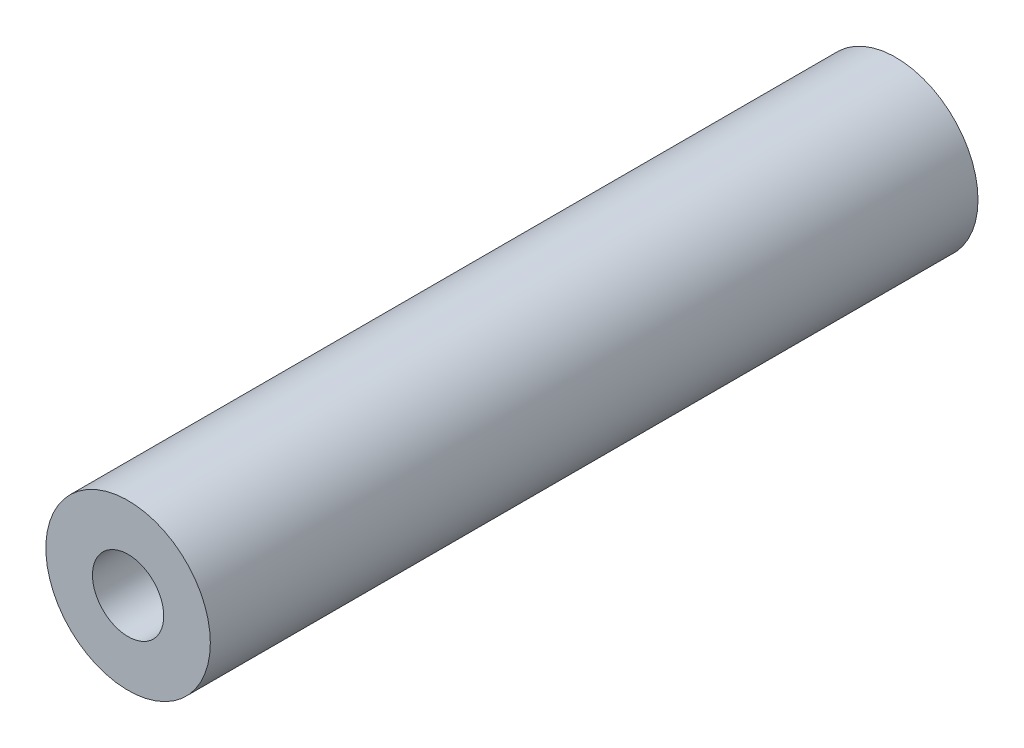
ISO-10303-21;
HEADER;
FILE_DESCRIPTION(('STEP AP214'),'2;1');
FILE_NAME('part.step','',(''),(''),'','','');
FILE_SCHEMA(('AUTOMOTIVE_DESIGN { 1 0 10303 214 1 1 1 1 }'));
ENDSEC;
DATA;
#1=APPLICATION_CONTEXT('core data for automotive mechanical design processes');
#2=APPLICATION_PROTOCOL_DEFINITION('international standard','automotive_design',2000,#1);
#3=PRODUCT_CONTEXT('',#1,'mechanical');
#4=PRODUCT('Part','Part','',(#3));
#5=PRODUCT_RELATED_PRODUCT_CATEGORY('part','',(#4));
#6=PRODUCT_DEFINITION_FORMATION('','',#4);
#7=PRODUCT_DEFINITION_CONTEXT('part definition',#1,'design');
#8=PRODUCT_DEFINITION('design','',#6,#7);
#9=PRODUCT_DEFINITION_SHAPE('','',#8);
#10=(LENGTH_UNIT() NAMED_UNIT(*) SI_UNIT(.MILLI.,.METRE.));
#11=(NAMED_UNIT(*) PLANE_ANGLE_UNIT() SI_UNIT($,.RADIAN.));
#12=(NAMED_UNIT(*) SI_UNIT($,.STERADIAN.) SOLID_ANGLE_UNIT());
#13=UNCERTAINTY_MEASURE_WITH_UNIT(LENGTH_MEASURE(1.E-05),#10,'distance_accuracy_value','');
#14=(GEOMETRIC_REPRESENTATION_CONTEXT(3) GLOBAL_UNCERTAINTY_ASSIGNED_CONTEXT((#13)) GLOBAL_UNIT_ASSIGNED_CONTEXT((#10,
#11,#12)) REPRESENTATION_CONTEXT('',''));
#15=CARTESIAN_POINT('',(0.,0.,0.));
#16=DIRECTION('',(0.,0.,1.));
#17=DIRECTION('',(1.,0.,0.));
#18=AXIS2_PLACEMENT_3D('',#15,#16,#17);
#19=CARTESIAN_POINT('',(0.,0.,28.));
#20=DIRECTION('',(0.,0.,1.));
#21=DIRECTION('',(1.,0.,0.));
#22=AXIS2_PLACEMENT_3D('',#19,#20,#21);
#23=PLANE('',#22);
#24=CARTESIAN_POINT('',(0.,0.,28.));
#25=DIRECTION('',(0.,0.,1.));
#26=DIRECTION('',(1.,0.,0.));
#27=AXIS2_PLACEMENT_3D('',#24,#25,#26);
#28=CIRCLE('',#27,3.);
#29=CARTESIAN_POINT('',(3.,0.,28.));
#30=VERTEX_POINT('',#29);
#31=EDGE_CURVE('E10',#30,#30,#28,.T.);
#32=ORIENTED_EDGE('',*,*,#31,.T.);
#33=EDGE_LOOP('',(#32));
#34=FACE_BOUND('',#33,.T.);
#35=CARTESIAN_POINT('',(0.,0.,28.));
#36=DIRECTION('',(0.,0.,1.));
#37=DIRECTION('',(1.,0.,0.));
#38=AXIS2_PLACEMENT_3D('',#35,#36,#37);
#39=CIRCLE('',#38,1.3);
#40=CARTESIAN_POINT('',(1.3,0.,28.));
#41=VERTEX_POINT('',#40);
#42=EDGE_CURVE('E55',#41,#41,#39,.T.);
#43=ORIENTED_EDGE('',*,*,#42,.F.);
#44=EDGE_LOOP('',(#43));
#45=FACE_BOUND('',#44,.T.);
#46=ADVANCED_FACE('F41',(#34,#45),#23,.T.);
#47=CARTESIAN_POINT('',(0.,0.,0.));
#48=DIRECTION('',(0.,0.,1.));
#49=DIRECTION('',(1.,0.,0.));
#50=AXIS2_PLACEMENT_3D('',#47,#48,#49);
#51=PLANE('',#50);
#52=CARTESIAN_POINT('',(0.,0.,0.));
#53=DIRECTION('',(0.,0.,1.));
#54=DIRECTION('',(1.,0.,0.));
#55=AXIS2_PLACEMENT_3D('',#52,#53,#54);
#56=CIRCLE('',#55,3.);
#57=CARTESIAN_POINT('',(3.,0.,0.));
#58=VERTEX_POINT('',#57);
#59=EDGE_CURVE('E44',#58,#58,#56,.T.);
#60=ORIENTED_EDGE('',*,*,#59,.F.);
#61=EDGE_LOOP('',(#60));
#62=FACE_BOUND('',#61,.T.);
#63=CARTESIAN_POINT('',(0.,0.,0.));
#64=DIRECTION('',(0.,0.,1.));
#65=DIRECTION('',(1.,0.,0.));
#66=AXIS2_PLACEMENT_3D('',#63,#64,#65);
#67=CIRCLE('',#66,1.3);
#68=CARTESIAN_POINT('',(1.3,0.,0.));
#69=VERTEX_POINT('',#68);
#70=EDGE_CURVE('E53',#69,#69,#67,.T.);
#71=ORIENTED_EDGE('',*,*,#70,.T.);
#72=EDGE_LOOP('',(#71));
#73=FACE_BOUND('',#72,.T.);
#74=ADVANCED_FACE('F63',(#62,#73),#51,.F.);
#75=CARTESIAN_POINT('',(0.,0.,28.));
#76=DIRECTION('',(0.,0.,-1.));
#77=DIRECTION('',(-1.,0.,0.));
#78=AXIS2_PLACEMENT_3D('',#75,#76,#77);
#79=CYLINDRICAL_SURFACE('',#78,3.);
#80=ORIENTED_EDGE('',*,*,#31,.F.);
#81=EDGE_LOOP('',(#80));
#82=FACE_BOUND('',#81,.T.);
#83=ORIENTED_EDGE('',*,*,#59,.T.);
#84=EDGE_LOOP('',(#83));
#85=FACE_BOUND('',#84,.T.);
#86=ADVANCED_FACE('F43',(#82,#85),#79,.T.);
#87=CARTESIAN_POINT('',(0.,0.,28.));
#88=DIRECTION('',(0.,0.,-1.));
#89=DIRECTION('',(-1.,0.,0.));
#90=AXIS2_PLACEMENT_3D('',#87,#88,#89);
#91=CYLINDRICAL_SURFACE('',#90,1.3);
#92=ORIENTED_EDGE('',*,*,#42,.T.);
#93=EDGE_LOOP('',(#92));
#94=FACE_BOUND('',#93,.T.);
#95=ORIENTED_EDGE('',*,*,#70,.F.);
#96=EDGE_LOOP('',(#95));
#97=FACE_BOUND('',#96,.T.);
#98=ADVANCED_FACE('F58',(#94,#97),#91,.F.);
#99=CLOSED_SHELL('',(#46,#74,#86,#98));
#100=MANIFOLD_SOLID_BREP('B2',#99);
#101=ADVANCED_BREP_SHAPE_REPRESENTATION('',(#18,#100),#14);
#102=SHAPE_DEFINITION_REPRESENTATION(#9,#101);
ENDSEC;
END-ISO-10303-21;
